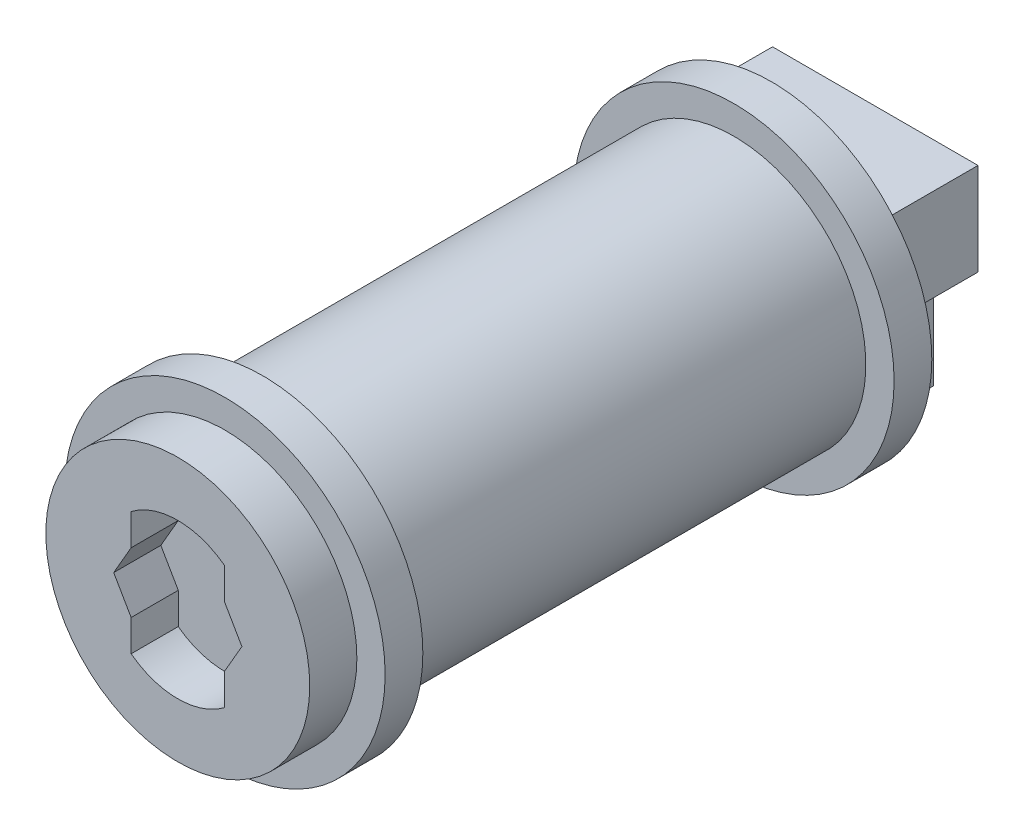
ISO-10303-21;
HEADER;
FILE_DESCRIPTION(('STEP AP214'),'2;1');
FILE_NAME('part.step','',(''),(''),'','','');
FILE_SCHEMA(('AUTOMOTIVE_DESIGN { 1 0 10303 214 1 1 1 1 }'));
ENDSEC;
DATA;
#1=APPLICATION_CONTEXT('core data for automotive mechanical design processes');
#2=APPLICATION_PROTOCOL_DEFINITION('international standard','automotive_design',2000,#1);
#3=PRODUCT_CONTEXT('',#1,'mechanical');
#4=PRODUCT('Part','Part','',(#3));
#5=PRODUCT_RELATED_PRODUCT_CATEGORY('part','',(#4));
#6=PRODUCT_DEFINITION_FORMATION('','',#4);
#7=PRODUCT_DEFINITION_CONTEXT('part definition',#1,'design');
#8=PRODUCT_DEFINITION('design','',#6,#7);
#9=PRODUCT_DEFINITION_SHAPE('','',#8);
#10=(LENGTH_UNIT() NAMED_UNIT(*) SI_UNIT(.MILLI.,.METRE.));
#11=(NAMED_UNIT(*) PLANE_ANGLE_UNIT() SI_UNIT($,.RADIAN.));
#12=(NAMED_UNIT(*) SI_UNIT($,.STERADIAN.) SOLID_ANGLE_UNIT());
#13=UNCERTAINTY_MEASURE_WITH_UNIT(LENGTH_MEASURE(1.E-05),#10,'distance_accuracy_value','');
#14=(GEOMETRIC_REPRESENTATION_CONTEXT(3) GLOBAL_UNCERTAINTY_ASSIGNED_CONTEXT((#13)) GLOBAL_UNIT_ASSIGNED_CONTEXT((#10,
#11,#12)) REPRESENTATION_CONTEXT('',''));
#15=CARTESIAN_POINT('',(0.,0.,0.));
#16=DIRECTION('',(0.,0.,1.));
#17=DIRECTION('',(1.,0.,0.));
#18=AXIS2_PLACEMENT_3D('',#15,#16,#17);
#19=CARTESIAN_POINT('',(-17.9999999993386,-1.27777996516976E-10,29.5));
#20=DIRECTION('',(0.,0.,-1.));
#21=DIRECTION('',(-1.,0.,0.));
#22=AXIS2_PLACEMENT_3D('',#19,#20,#21);
#23=CYLINDRICAL_SURFACE('',#22,7.00000000066145);
#24=CARTESIAN_POINT('',(-17.9999999993386,-1.27777996516976E-10,0.));
#25=DIRECTION('',(0.,0.,-1.));
#26=DIRECTION('',(-1.,0.,0.));
#27=AXIS2_PLACEMENT_3D('',#24,#25,#26);
#28=CIRCLE('',#27,7.00000000066145);
#29=CARTESIAN_POINT('',(-25.,-1.27777996516976E-10,0.));
#30=VERTEX_POINT('',#29);
#31=EDGE_CURVE('E249',#30,#30,#28,.F.);
#32=ORIENTED_EDGE('',*,*,#31,.T.);
#33=EDGE_LOOP('',(#32));
#34=FACE_BOUND('',#33,.T.);
#35=CARTESIAN_POINT('',(-17.9999999993386,-1.27777996516976E-10,25.));
#36=DIRECTION('',(0.,0.,1.));
#37=DIRECTION('',(1.,0.,0.));
#38=AXIS2_PLACEMENT_3D('',#35,#36,#37);
#39=CIRCLE('',#38,7.00000000066145);
#40=CARTESIAN_POINT('',(-10.9999999986771,-1.27777996516976E-10,25.));
#41=VERTEX_POINT('',#40);
#42=EDGE_CURVE('E11',#41,#41,#39,.T.);
#43=ORIENTED_EDGE('',*,*,#42,.F.);
#44=EDGE_LOOP('',(#43));
#45=FACE_BOUND('',#44,.T.);
#46=ADVANCED_FACE('F37',(#34,#45),#23,.T.);
#47=CARTESIAN_POINT('',(-17.9999999993386,-1.27777996516976E-10,29.5));
#48=DIRECTION('',(0.,0.,-1.));
#49=DIRECTION('',(-1.,0.,0.));
#50=AXIS2_PLACEMENT_3D('',#47,#48,#49);
#51=CYLINDRICAL_SURFACE('',#50,4.1);
#52=DIRECTION('',(0.,0.,-1.));
#53=VECTOR('',#52,1.);
#54=CARTESIAN_POINT('',(-20.475,-3.26869622289395,29.5));
#55=LINE('',#54,#53);
#56=CARTESIAN_POINT('',(-20.475,-3.26869622289395,25.));
#57=VERTEX_POINT('',#56);
#58=CARTESIAN_POINT('',(-20.475,-3.26869622289395,0.));
#59=VERTEX_POINT('',#58);
#60=EDGE_CURVE('E236',#57,#59,#55,.T.);
#61=ORIENTED_EDGE('',*,*,#60,.F.);
#62=CARTESIAN_POINT('',(-17.9999999993386,-1.27777996516976E-10,25.));
#63=DIRECTION('',(0.,0.,1.));
#64=DIRECTION('',(1.,0.,0.));
#65=AXIS2_PLACEMENT_3D('',#62,#63,#64);
#66=CIRCLE('',#65,4.1);
#67=CARTESIAN_POINT('',(-15.5249999991788,-3.2686962232738,25.));
#68=VERTEX_POINT('',#67);
#69=EDGE_CURVE('E389',#57,#68,#66,.T.);
#70=ORIENTED_EDGE('',*,*,#69,.T.);
#71=DIRECTION('',(0.,0.,-1.));
#72=VECTOR('',#71,1.);
#73=CARTESIAN_POINT('',(-15.5249999991788,-3.2686962232738,29.5));
#74=LINE('',#73,#72);
#75=CARTESIAN_POINT('',(-15.5249999991788,-3.2686962232738,0.));
#76=VERTEX_POINT('',#75);
#77=EDGE_CURVE('E329',#68,#76,#74,.T.);
#78=ORIENTED_EDGE('',*,*,#77,.T.);
#79=CARTESIAN_POINT('',(-17.9999999993386,-1.27777996516976E-10,0.));
#80=DIRECTION('',(0.,0.,1.));
#81=DIRECTION('',(1.,0.,0.));
#82=AXIS2_PLACEMENT_3D('',#79,#80,#81);
#83=CIRCLE('',#82,4.1);
#84=EDGE_CURVE('E386',#59,#76,#83,.T.);
#85=ORIENTED_EDGE('',*,*,#84,.F.);
#86=EDGE_LOOP('',(#61,#70,#78,#85));
#87=FACE_BOUND('',#86,.T.);
#88=ADVANCED_FACE('F473',(#87),#51,.F.);
#89=CARTESIAN_POINT('',(-15.5249999991788,-3.2686962232738,29.5));
#90=DIRECTION('',(-1.,0.,0.));
#91=DIRECTION('',(0.,0.,1.));
#92=AXIS2_PLACEMENT_3D('',#89,#90,#91);
#93=PLANE('',#92);
#94=ORIENTED_EDGE('',*,*,#77,.F.);
#95=DIRECTION('',(0.,1.,0.));
#96=VECTOR('',#95,1.);
#97=CARTESIAN_POINT('',(-15.5249999991788,-3.2686962232738,25.));
#98=LINE('',#97,#96);
#99=CARTESIAN_POINT('',(-15.5249999991788,-1.60214699517567,25.));
#100=VERTEX_POINT('',#99);
#101=EDGE_CURVE('E411',#68,#100,#98,.T.);
#102=ORIENTED_EDGE('',*,*,#101,.T.);
#103=DIRECTION('',(0.,0.,-1.));
#104=VECTOR('',#103,1.);
#105=CARTESIAN_POINT('',(-15.5249999991788,-1.60214699517567,29.5));
#106=LINE('',#105,#104);
#107=CARTESIAN_POINT('',(-15.5249999991788,-1.60214699517567,0.));
#108=VERTEX_POINT('',#107);
#109=EDGE_CURVE('E332',#100,#108,#106,.T.);
#110=ORIENTED_EDGE('',*,*,#109,.T.);
#111=DIRECTION('',(0.,1.,0.));
#112=VECTOR('',#111,1.);
#113=CARTESIAN_POINT('',(-15.5249999991788,-3.2686962232738,0.));
#114=LINE('',#113,#112);
#115=EDGE_CURVE('E383',#76,#108,#114,.T.);
#116=ORIENTED_EDGE('',*,*,#115,.F.);
#117=EDGE_LOOP('',(#94,#102,#110,#116));
#118=FACE_BOUND('',#117,.T.);
#119=ADVANCED_FACE('F481',(#118),#93,.T.);
#120=CARTESIAN_POINT('',(-15.5249999991788,-1.60214699517567,29.5));
#121=DIRECTION('',(-0.866025403784438,0.5,0.));
#122=DIRECTION('',(-0.5,-0.866025403784439,0.));
#123=AXIS2_PLACEMENT_3D('',#120,#121,#122);
#124=PLANE('',#123);
#125=ORIENTED_EDGE('',*,*,#109,.F.);
#126=DIRECTION('',(0.5,0.866025403784439,0.));
#127=VECTOR('',#126,1.);
#128=CARTESIAN_POINT('',(-15.5249999991788,-1.60214699517567,25.));
#129=LINE('',#128,#127);
#130=CARTESIAN_POINT('',(-14.5999999984554,3.07850450836688E-09,25.));
#131=VERTEX_POINT('',#130);
#132=EDGE_CURVE('E414',#100,#131,#129,.T.);
#133=ORIENTED_EDGE('',*,*,#132,.T.);
#134=DIRECTION('',(0.,0.,-1.));
#135=VECTOR('',#134,1.);
#136=CARTESIAN_POINT('',(-14.5999999984554,3.07850450836688E-09,29.5));
#137=LINE('',#136,#135);
#138=CARTESIAN_POINT('',(-14.5999999984554,3.07850450836688E-09,0.));
#139=VERTEX_POINT('',#138);
#140=EDGE_CURVE('E335',#131,#139,#137,.T.);
#141=ORIENTED_EDGE('',*,*,#140,.T.);
#142=DIRECTION('',(0.5,0.866025403784439,0.));
#143=VECTOR('',#142,1.);
#144=CARTESIAN_POINT('',(-15.5249999991788,-1.60214699517567,0.));
#145=LINE('',#144,#143);
#146=EDGE_CURVE('E380',#108,#139,#145,.T.);
#147=ORIENTED_EDGE('',*,*,#146,.F.);
#148=EDGE_LOOP('',(#125,#133,#141,#147));
#149=FACE_BOUND('',#148,.T.);
#150=ADVANCED_FACE('F572',(#149),#124,.T.);
#151=CARTESIAN_POINT('',(-14.5999999984554,3.07850450836688E-09,29.5));
#152=DIRECTION('',(-0.866025402836809,-0.500000001641344,0.));
#153=DIRECTION('',(0.500000001641344,-0.866025402836809,0.));
#154=AXIS2_PLACEMENT_3D('',#151,#152,#153);
#155=PLANE('',#154);
#156=ORIENTED_EDGE('',*,*,#140,.F.);
#157=DIRECTION('',(-0.500000001641344,0.866025402836809,0.));
#158=VECTOR('',#157,1.);
#159=CARTESIAN_POINT('',(-14.5999999984554,3.07850450836688E-09,25.));
#160=LINE('',#159,#158);
#161=CARTESIAN_POINT('',(-15.5249999991788,1.60214699432022,25.));
#162=VERTEX_POINT('',#161);
#163=EDGE_CURVE('E417',#131,#162,#160,.T.);
#164=ORIENTED_EDGE('',*,*,#163,.T.);
#165=DIRECTION('',(0.,0.,-1.));
#166=VECTOR('',#165,1.);
#167=CARTESIAN_POINT('',(-15.5249999991788,1.60214699432022,29.5));
#168=LINE('',#167,#166);
#169=CARTESIAN_POINT('',(-15.5249999991788,1.60214699432022,0.));
#170=VERTEX_POINT('',#169);
#171=EDGE_CURVE('E339',#162,#170,#168,.T.);
#172=ORIENTED_EDGE('',*,*,#171,.T.);
#173=DIRECTION('',(-0.500000001641344,0.866025402836808,0.));
#174=VECTOR('',#173,1.);
#175=CARTESIAN_POINT('',(-14.5999999984554,3.07850450836688E-09,0.));
#176=LINE('',#175,#174);
#177=EDGE_CURVE('E377',#139,#170,#176,.T.);
#178=ORIENTED_EDGE('',*,*,#177,.F.);
#179=EDGE_LOOP('',(#156,#164,#172,#178));
#180=FACE_BOUND('',#179,.T.);
#181=ADVANCED_FACE('F569',(#180),#155,.T.);
#182=CARTESIAN_POINT('',(-15.5249999991788,1.60214699432022,29.5));
#183=DIRECTION('',(-1.,0.,0.));
#184=DIRECTION('',(0.,0.,1.));
#185=AXIS2_PLACEMENT_3D('',#182,#183,#184);
#186=PLANE('',#185);
#187=ORIENTED_EDGE('',*,*,#171,.F.);
#188=DIRECTION('',(0.,1.,0.));
#189=VECTOR('',#188,1.);
#190=CARTESIAN_POINT('',(-15.5249999991788,1.60214699432022,25.));
#191=LINE('',#190,#189);
#192=CARTESIAN_POINT('',(-15.5249999991788,3.26869622301824,25.));
#193=VERTEX_POINT('',#192);
#194=EDGE_CURVE('E420',#162,#193,#191,.T.);
#195=ORIENTED_EDGE('',*,*,#194,.T.);
#196=DIRECTION('',(0.,0.,-1.));
#197=VECTOR('',#196,1.);
#198=CARTESIAN_POINT('',(-15.5249999991788,3.26869622301824,29.5));
#199=LINE('',#198,#197);
#200=CARTESIAN_POINT('',(-15.5249999991788,3.26869622301824,0.));
#201=VERTEX_POINT('',#200);
#202=EDGE_CURVE('E343',#193,#201,#199,.T.);
#203=ORIENTED_EDGE('',*,*,#202,.T.);
#204=DIRECTION('',(0.,1.,0.));
#205=VECTOR('',#204,1.);
#206=CARTESIAN_POINT('',(-15.5249999991788,1.60214699432022,0.));
#207=LINE('',#206,#205);
#208=EDGE_CURVE('E374',#170,#201,#207,.T.);
#209=ORIENTED_EDGE('',*,*,#208,.F.);
#210=EDGE_LOOP('',(#187,#195,#203,#209));
#211=FACE_BOUND('',#210,.T.);
#212=ADVANCED_FACE('F564',(#211),#186,.T.);
#213=CARTESIAN_POINT('',(-17.9999999993386,-1.27777996516976E-10,29.5));
#214=DIRECTION('',(0.,0.,-1.));
#215=DIRECTION('',(-1.,0.,0.));
#216=AXIS2_PLACEMENT_3D('',#213,#214,#215);
#217=CYLINDRICAL_SURFACE('',#216,4.1);
#218=ORIENTED_EDGE('',*,*,#202,.F.);
#219=CARTESIAN_POINT('',(-17.9999999993386,-1.27777996516976E-10,25.));
#220=DIRECTION('',(0.,0.,1.));
#221=DIRECTION('',(1.,0.,0.));
#222=AXIS2_PLACEMENT_3D('',#219,#220,#221);
#223=CIRCLE('',#222,4.1);
#224=CARTESIAN_POINT('',(-20.475,3.2686962226384,25.));
#225=VERTEX_POINT('',#224);
#226=EDGE_CURVE('E423',#193,#225,#223,.T.);
#227=ORIENTED_EDGE('',*,*,#226,.T.);
#228=DIRECTION('',(0.,0.,-1.));
#229=VECTOR('',#228,1.);
#230=CARTESIAN_POINT('',(-20.475,3.2686962226384,29.5));
#231=LINE('',#230,#229);
#232=CARTESIAN_POINT('',(-20.475,3.2686962226384,0.));
#233=VERTEX_POINT('',#232);
#234=EDGE_CURVE('E347',#225,#233,#231,.T.);
#235=ORIENTED_EDGE('',*,*,#234,.T.);
#236=CARTESIAN_POINT('',(-17.9999999993386,-1.27777996516976E-10,0.));
#237=DIRECTION('',(0.,0.,1.));
#238=DIRECTION('',(1.,0.,0.));
#239=AXIS2_PLACEMENT_3D('',#236,#237,#238);
#240=CIRCLE('',#239,4.1);
#241=EDGE_CURVE('E371',#201,#233,#240,.T.);
#242=ORIENTED_EDGE('',*,*,#241,.F.);
#243=EDGE_LOOP('',(#218,#227,#235,#242));
#244=FACE_BOUND('',#243,.T.);
#245=ADVANCED_FACE('F561',(#244),#217,.F.);
#246=CARTESIAN_POINT('',(-20.475,3.2686962226384,29.5));
#247=DIRECTION('',(1.,0.,0.));
#248=DIRECTION('',(0.,0.,-1.));
#249=AXIS2_PLACEMENT_3D('',#246,#247,#248);
#250=PLANE('',#249);
#251=ORIENTED_EDGE('',*,*,#234,.F.);
#252=DIRECTION('',(0.,-1.,0.));
#253=VECTOR('',#252,1.);
#254=CARTESIAN_POINT('',(-20.475,3.2686962226384,25.));
#255=LINE('',#254,#253);
#256=CARTESIAN_POINT('',(-20.475,1.60214699504789,25.));
#257=VERTEX_POINT('',#256);
#258=EDGE_CURVE('E426',#225,#257,#255,.T.);
#259=ORIENTED_EDGE('',*,*,#258,.T.);
#260=DIRECTION('',(0.,0.,-1.));
#261=VECTOR('',#260,1.);
#262=CARTESIAN_POINT('',(-20.475,1.60214699504789,29.5));
#263=LINE('',#262,#261);
#264=CARTESIAN_POINT('',(-20.475,1.60214699504789,0.));
#265=VERTEX_POINT('',#264);
#266=EDGE_CURVE('E351',#257,#265,#263,.T.);
#267=ORIENTED_EDGE('',*,*,#266,.T.);
#268=DIRECTION('',(0.,-1.,0.));
#269=VECTOR('',#268,1.);
#270=CARTESIAN_POINT('',(-20.475,3.2686962226384,0.));
#271=LINE('',#270,#269);
#272=EDGE_CURVE('E368',#233,#265,#271,.T.);
#273=ORIENTED_EDGE('',*,*,#272,.F.);
#274=EDGE_LOOP('',(#251,#259,#267,#273));
#275=FACE_BOUND('',#274,.T.);
#276=ADVANCED_FACE('F547',(#275),#250,.T.);
#277=CARTESIAN_POINT('',(-20.475,1.60214699504789,29.5));
#278=DIRECTION('',(0.866025404040016,-0.499999999557327,0.));
#279=DIRECTION('',(0.499999999557327,0.866025404040016,0.));
#280=AXIS2_PLACEMENT_3D('',#277,#278,#279);
#281=PLANE('',#280);
#282=ORIENTED_EDGE('',*,*,#266,.F.);
#283=DIRECTION('',(-0.499999999557327,-0.866025404040016,0.));
#284=VECTOR('',#283,1.);
#285=CARTESIAN_POINT('',(-20.475,1.60214699504789,25.));
#286=LINE('',#285,#284);
#287=CARTESIAN_POINT('',(-21.3999999985215,-1.28368837911882E-09,25.));
#288=VERTEX_POINT('',#287);
#289=EDGE_CURVE('E429',#257,#288,#286,.T.);
#290=ORIENTED_EDGE('',*,*,#289,.T.);
#291=DIRECTION('',(0.,0.,-1.));
#292=VECTOR('',#291,1.);
#293=CARTESIAN_POINT('',(-21.3999999985215,-1.28368837911882E-09,29.5));
#294=LINE('',#293,#292);
#295=CARTESIAN_POINT('',(-21.3999999985215,-1.28368837911882E-09,0.));
#296=VERTEX_POINT('',#295);
#297=EDGE_CURVE('E355',#288,#296,#294,.T.);
#298=ORIENTED_EDGE('',*,*,#297,.T.);
#299=DIRECTION('',(-0.499999999557327,-0.866025404040016,0.));
#300=VECTOR('',#299,1.);
#301=CARTESIAN_POINT('',(-20.475,1.60214699504789,0.));
#302=LINE('',#301,#300);
#303=EDGE_CURVE('E365',#265,#296,#302,.T.);
#304=ORIENTED_EDGE('',*,*,#303,.F.);
#305=EDGE_LOOP('',(#282,#290,#298,#304));
#306=FACE_BOUND('',#305,.T.);
#307=ADVANCED_FACE('F536',(#306),#281,.T.);
#308=CARTESIAN_POINT('',(-21.3999999985215,-1.28368837911882E-09,29.5));
#309=DIRECTION('',(0.866025403784439,0.5,0.));
#310=DIRECTION('',(-0.5,0.866025403784439,0.));
#311=AXIS2_PLACEMENT_3D('',#308,#309,#310);
#312=PLANE('',#311);
#313=ORIENTED_EDGE('',*,*,#297,.F.);
#314=DIRECTION('',(0.5,-0.866025403784439,0.));
#315=VECTOR('',#314,1.);
#316=CARTESIAN_POINT('',(-21.3999999985215,-1.28368837911882E-09,25.));
#317=LINE('',#316,#315);
#318=CARTESIAN_POINT('',(-20.475,-1.602146995724,25.));
#319=VERTEX_POINT('',#318);
#320=EDGE_CURVE('E432',#288,#319,#317,.T.);
#321=ORIENTED_EDGE('',*,*,#320,.T.);
#322=DIRECTION('',(0.,0.,-1.));
#323=VECTOR('',#322,1.);
#324=CARTESIAN_POINT('',(-20.475,-1.602146995724,29.5));
#325=LINE('',#324,#323);
#326=CARTESIAN_POINT('',(-20.475,-1.602146995724,0.));
#327=VERTEX_POINT('',#326);
#328=EDGE_CURVE('E235',#319,#327,#325,.T.);
#329=ORIENTED_EDGE('',*,*,#328,.T.);
#330=DIRECTION('',(0.5,-0.866025403784439,0.));
#331=VECTOR('',#330,1.);
#332=CARTESIAN_POINT('',(-21.3999999985215,-1.28368837911882E-09,0.));
#333=LINE('',#332,#331);
#334=EDGE_CURVE('E362',#296,#327,#333,.T.);
#335=ORIENTED_EDGE('',*,*,#334,.F.);
#336=EDGE_LOOP('',(#313,#321,#329,#335));
#337=FACE_BOUND('',#336,.T.);
#338=ADVANCED_FACE('F531',(#337),#312,.T.);
#339=CARTESIAN_POINT('',(-20.475,-1.602146995724,29.5));
#340=DIRECTION('',(1.,0.,0.));
#341=DIRECTION('',(0.,0.,-1.));
#342=AXIS2_PLACEMENT_3D('',#339,#340,#341);
#343=PLANE('',#342);
#344=ORIENTED_EDGE('',*,*,#328,.F.);
#345=DIRECTION('',(0.,-1.,0.));
#346=VECTOR('',#345,1.);
#347=CARTESIAN_POINT('',(-20.475,-1.602146995724,25.));
#348=LINE('',#347,#346);
#349=EDGE_CURVE('E41',#319,#57,#348,.T.);
#350=ORIENTED_EDGE('',*,*,#349,.T.);
#351=ORIENTED_EDGE('',*,*,#60,.T.);
#352=DIRECTION('',(0.,-1.,0.));
#353=VECTOR('',#352,1.);
#354=CARTESIAN_POINT('',(-20.475,-1.602146995724,0.));
#355=LINE('',#354,#353);
#356=EDGE_CURVE('E358',#327,#59,#355,.T.);
#357=ORIENTED_EDGE('',*,*,#356,.F.);
#358=EDGE_LOOP('',(#344,#350,#351,#357));
#359=FACE_BOUND('',#358,.T.);
#360=ADVANCED_FACE('F538',(#359),#343,.T.);
#361=CARTESIAN_POINT('',(-14.5592,-4.1492,0.));
#362=DIRECTION('',(0.,0.,-1.));
#363=DIRECTION('',(-1.,0.,0.));
#364=AXIS2_PLACEMENT_3D('',#361,#362,#363);
#365=PLANE('',#364);
#366=CARTESIAN_POINT('',(-18.,0.,0.));
#367=DIRECTION('',(0.,0.,1.));
#368=DIRECTION('',(1.,0.,0.));
#369=AXIS2_PLACEMENT_3D('',#366,#367,#368);
#370=CIRCLE('',#369,8.5);
#371=CARTESIAN_POINT('',(-9.5,0.,0.));
#372=VERTEX_POINT('',#371);
#373=EDGE_CURVE('E255',#372,#372,#370,.T.);
#374=ORIENTED_EDGE('',*,*,#373,.T.);
#375=EDGE_LOOP('',(#374));
#376=FACE_BOUND('',#375,.T.);
#377=ORIENTED_EDGE('',*,*,#31,.F.);
#378=EDGE_LOOP('',(#377));
#379=FACE_BOUND('',#378,.T.);
#380=ADVANCED_FACE('F545',(#376,#379),#365,.F.);
#381=CARTESIAN_POINT('',(-9.398,-8.602,-2.));
#382=DIRECTION('',(0.,0.,-1.));
#383=DIRECTION('',(-1.,0.,0.));
#384=AXIS2_PLACEMENT_3D('',#381,#382,#383);
#385=PLANE('',#384);
#386=CARTESIAN_POINT('',(-18.,0.,-2.));
#387=DIRECTION('',(0.,0.,1.));
#388=DIRECTION('',(1.,0.,0.));
#389=AXIS2_PLACEMENT_3D('',#386,#387,#388);
#390=CIRCLE('',#389,8.5);
#391=CARTESIAN_POINT('',(-9.5,0.,-2.));
#392=VERTEX_POINT('',#391);
#393=EDGE_CURVE('E252',#392,#392,#390,.F.);
#394=ORIENTED_EDGE('',*,*,#393,.T.);
#395=EDGE_LOOP('',(#394));
#396=FACE_BOUND('',#395,.T.);
#397=DIRECTION('',(1.,0.,0.));
#398=VECTOR('',#397,1.);
#399=CARTESIAN_POINT('',(-12.549999998012,4.629434044448,-2.));
#400=LINE('',#399,#398);
#401=CARTESIAN_POINT('',(-23.450000000994,4.629434044448,-2.));
#402=VERTEX_POINT('',#401);
#403=CARTESIAN_POINT('',(-12.549999998012,4.629434044448,-2.));
#404=VERTEX_POINT('',#403);
#405=EDGE_CURVE('E299',#402,#404,#400,.T.);
#406=ORIENTED_EDGE('',*,*,#405,.F.);
#407=DIRECTION('',(0.,1.,0.));
#408=VECTOR('',#407,1.);
#409=CARTESIAN_POINT('',(-23.450000000994,4.629434044448,-2.));
#410=LINE('',#409,#408);
#411=CARTESIAN_POINT('',(-23.450000000994,-0.270565961522,-2.));
#412=VERTEX_POINT('',#411);
#413=EDGE_CURVE('E301',#412,#402,#410,.T.);
#414=ORIENTED_EDGE('',*,*,#413,.F.);
#415=DIRECTION('',(-1.,0.,0.));
#416=VECTOR('',#415,1.);
#417=CARTESIAN_POINT('',(-23.450000000994,-0.270565961522,-2.));
#418=LINE('',#417,#416);
#419=CARTESIAN_POINT('',(-21.099999998553,-0.270565961521999,-2.));
#420=VERTEX_POINT('',#419);
#421=EDGE_CURVE('E285',#420,#412,#418,.T.);
#422=ORIENTED_EDGE('',*,*,#421,.F.);
#423=DIRECTION('',(0.,1.,0.));
#424=VECTOR('',#423,1.);
#425=CARTESIAN_POINT('',(-21.099999998553,-0.270565961521999,-2.));
#426=LINE('',#425,#424);
#427=CARTESIAN_POINT('',(-21.099999998553,-6.670565961032,-2.));
#428=VERTEX_POINT('',#427);
#429=EDGE_CURVE('E288',#428,#420,#426,.T.);
#430=ORIENTED_EDGE('',*,*,#429,.F.);
#431=DIRECTION('',(-1.,0.,0.));
#432=VECTOR('',#431,1.);
#433=CARTESIAN_POINT('',(-21.099999998553,-6.670565961032,-2.));
#434=LINE('',#433,#432);
#435=CARTESIAN_POINT('',(-14.900000001447,-6.670565961032,-2.));
#436=VERTEX_POINT('',#435);
#437=EDGE_CURVE('E291',#436,#428,#434,.T.);
#438=ORIENTED_EDGE('',*,*,#437,.F.);
#439=DIRECTION('',(0.,-1.,0.));
#440=VECTOR('',#439,1.);
#441=CARTESIAN_POINT('',(-14.900000001447,-6.670565961032,-2.));
#442=LINE('',#441,#440);
#443=CARTESIAN_POINT('',(-14.900000001447,-0.270565961522,-2.));
#444=VERTEX_POINT('',#443);
#445=EDGE_CURVE('E293',#444,#436,#442,.T.);
#446=ORIENTED_EDGE('',*,*,#445,.F.);
#447=DIRECTION('',(-1.,0.,0.));
#448=VECTOR('',#447,1.);
#449=CARTESIAN_POINT('',(-14.900000001447,-0.270565961522,-2.));
#450=LINE('',#449,#448);
#451=CARTESIAN_POINT('',(-12.549999998012,-0.270565961522,-2.));
#452=VERTEX_POINT('',#451);
#453=EDGE_CURVE('E295',#452,#444,#450,.T.);
#454=ORIENTED_EDGE('',*,*,#453,.F.);
#455=DIRECTION('',(0.,-1.,0.));
#456=VECTOR('',#455,1.);
#457=CARTESIAN_POINT('',(-12.549999998012,-0.270565961522,-2.));
#458=LINE('',#457,#456);
#459=EDGE_CURVE('E297',#404,#452,#458,.T.);
#460=ORIENTED_EDGE('',*,*,#459,.F.);
#461=EDGE_LOOP('',(#406,#414,#422,#430,#438,#446,#454,#460));
#462=FACE_BOUND('',#461,.T.);
#463=ADVANCED_FACE('F585',(#396,#462),#385,.T.);
#464=CARTESIAN_POINT('',(-18.,0.,-2.));
#465=DIRECTION('',(0.,0.,1.));
#466=DIRECTION('',(1.,0.,0.));
#467=AXIS2_PLACEMENT_3D('',#464,#465,#466);
#468=CYLINDRICAL_SURFACE('',#467,8.5);
#469=ORIENTED_EDGE('',*,*,#373,.F.);
#470=EDGE_LOOP('',(#469));
#471=FACE_BOUND('',#470,.T.);
#472=ORIENTED_EDGE('',*,*,#393,.F.);
#473=EDGE_LOOP('',(#472));
#474=FACE_BOUND('',#473,.T.);
#475=ADVANCED_FACE('F584',(#471,#474),#468,.T.);
#476=ORIENTED_EDGE('',*,*,#356,.T.);
#477=ORIENTED_EDGE('',*,*,#84,.T.);
#478=ORIENTED_EDGE('',*,*,#115,.T.);
#479=ORIENTED_EDGE('',*,*,#146,.T.);
#480=ORIENTED_EDGE('',*,*,#177,.T.);
#481=ORIENTED_EDGE('',*,*,#208,.T.);
#482=ORIENTED_EDGE('',*,*,#241,.T.);
#483=ORIENTED_EDGE('',*,*,#272,.T.);
#484=ORIENTED_EDGE('',*,*,#303,.T.);
#485=ORIENTED_EDGE('',*,*,#334,.T.);
#486=EDGE_LOOP('',(#476,#477,#478,#479,#480,#481,#482,#483,#484,#485));
#487=FACE_BOUND('',#486,.T.);
#488=CARTESIAN_POINT('',(-18.,0.,0.));
#489=DIRECTION('',(0.,0.,1.));
#490=DIRECTION('',(1.,0.,0.));
#491=AXIS2_PLACEMENT_3D('',#488,#489,#490);
#492=CIRCLE('',#491,1.89999999999999);
#493=CARTESIAN_POINT('',(-16.1,0.,0.));
#494=VERTEX_POINT('',#493);
#495=EDGE_CURVE('E322',#494,#494,#492,.T.);
#496=ORIENTED_EDGE('',*,*,#495,.F.);
#497=EDGE_LOOP('',(#496));
#498=FACE_BOUND('',#497,.T.);
#499=ADVANCED_FACE('F39',(#487,#498),#365,.F.);
#500=CARTESIAN_POINT('',(-23.450000000994,4.629434044448,-7.5));
#501=DIRECTION('',(1.,0.,0.));
#502=DIRECTION('',(0.,0.,-1.));
#503=AXIS2_PLACEMENT_3D('',#500,#501,#502);
#504=PLANE('',#503);
#505=ORIENTED_EDGE('',*,*,#413,.T.);
#506=DIRECTION('',(0.,0.,1.));
#507=VECTOR('',#506,1.);
#508=CARTESIAN_POINT('',(-23.450000000994,4.629434044448,-7.5));
#509=LINE('',#508,#507);
#510=CARTESIAN_POINT('',(-23.450000000994,4.629434044448,-7.5));
#511=VERTEX_POINT('',#510);
#512=EDGE_CURVE('E259',#511,#402,#509,.T.);
#513=ORIENTED_EDGE('',*,*,#512,.F.);
#514=DIRECTION('',(0.,1.,0.));
#515=VECTOR('',#514,1.);
#516=CARTESIAN_POINT('',(-23.450000000994,4.629434044448,-7.5));
#517=LINE('',#516,#515);
#518=CARTESIAN_POINT('',(-23.450000000994,-0.270565961522,-7.5));
#519=VERTEX_POINT('',#518);
#520=EDGE_CURVE('E287',#519,#511,#517,.T.);
#521=ORIENTED_EDGE('',*,*,#520,.F.);
#522=DIRECTION('',(0.,0.,1.));
#523=VECTOR('',#522,1.);
#524=CARTESIAN_POINT('',(-23.450000000994,-0.270565961522,-7.5));
#525=LINE('',#524,#523);
#526=EDGE_CURVE('E281',#519,#412,#525,.T.);
#527=ORIENTED_EDGE('',*,*,#526,.T.);
#528=EDGE_LOOP('',(#505,#513,#521,#527));
#529=FACE_BOUND('',#528,.T.);
#530=ADVANCED_FACE('F583',(#529),#504,.F.);
#531=CARTESIAN_POINT('',(-12.549999998012,4.629434044448,-7.5));
#532=DIRECTION('',(0.,-1.,0.));
#533=DIRECTION('',(0.,0.,-1.));
#534=AXIS2_PLACEMENT_3D('',#531,#532,#533);
#535=PLANE('',#534);
#536=ORIENTED_EDGE('',*,*,#405,.T.);
#537=DIRECTION('',(0.,0.,1.));
#538=VECTOR('',#537,1.);
#539=CARTESIAN_POINT('',(-12.549999998012,4.629434044448,-7.5));
#540=LINE('',#539,#538);
#541=CARTESIAN_POINT('',(-12.549999998012,4.629434044448,-7.5));
#542=VERTEX_POINT('',#541);
#543=EDGE_CURVE('E264',#542,#404,#540,.T.);
#544=ORIENTED_EDGE('',*,*,#543,.F.);
#545=DIRECTION('',(1.,0.,0.));
#546=VECTOR('',#545,1.);
#547=CARTESIAN_POINT('',(-12.549999998012,4.629434044448,-7.5));
#548=LINE('',#547,#546);
#549=EDGE_CURVE('E316',#511,#542,#548,.T.);
#550=ORIENTED_EDGE('',*,*,#549,.F.);
#551=ORIENTED_EDGE('',*,*,#512,.T.);
#552=EDGE_LOOP('',(#536,#544,#550,#551));
#553=FACE_BOUND('',#552,.T.);
#554=ADVANCED_FACE('F623',(#553),#535,.F.);
#555=CARTESIAN_POINT('',(-12.549999998012,-0.270565961522,-7.5));
#556=DIRECTION('',(-1.,0.,0.));
#557=DIRECTION('',(0.,0.,1.));
#558=AXIS2_PLACEMENT_3D('',#555,#556,#557);
#559=PLANE('',#558);
#560=ORIENTED_EDGE('',*,*,#459,.T.);
#561=DIRECTION('',(0.,0.,1.));
#562=VECTOR('',#561,1.);
#563=CARTESIAN_POINT('',(-12.549999998012,-0.270565961522,-7.5));
#564=LINE('',#563,#562);
#565=CARTESIAN_POINT('',(-12.549999998012,-0.270565961522,-7.5));
#566=VERTEX_POINT('',#565);
#567=EDGE_CURVE('E267',#566,#452,#564,.T.);
#568=ORIENTED_EDGE('',*,*,#567,.F.);
#569=DIRECTION('',(0.,-1.,0.));
#570=VECTOR('',#569,1.);
#571=CARTESIAN_POINT('',(-12.549999998012,-0.270565961522,-7.5));
#572=LINE('',#571,#570);
#573=EDGE_CURVE('E314',#542,#566,#572,.T.);
#574=ORIENTED_EDGE('',*,*,#573,.F.);
#575=ORIENTED_EDGE('',*,*,#543,.T.);
#576=EDGE_LOOP('',(#560,#568,#574,#575));
#577=FACE_BOUND('',#576,.T.);
#578=ADVANCED_FACE('F619',(#577),#559,.F.);
#579=CARTESIAN_POINT('',(-14.900000001447,-0.270565961522,-7.5));
#580=DIRECTION('',(0.,1.,0.));
#581=DIRECTION('',(-1.,0.,0.));
#582=AXIS2_PLACEMENT_3D('',#579,#580,#581);
#583=PLANE('',#582);
#584=ORIENTED_EDGE('',*,*,#453,.T.);
#585=DIRECTION('',(0.,0.,1.));
#586=VECTOR('',#585,1.);
#587=CARTESIAN_POINT('',(-14.900000001447,-0.270565961522,-7.5));
#588=LINE('',#587,#586);
#589=CARTESIAN_POINT('',(-14.900000001447,-0.270565961522,-7.5));
#590=VERTEX_POINT('',#589);
#591=EDGE_CURVE('E270',#590,#444,#588,.T.);
#592=ORIENTED_EDGE('',*,*,#591,.F.);
#593=DIRECTION('',(-1.,0.,0.));
#594=VECTOR('',#593,1.);
#595=CARTESIAN_POINT('',(-14.900000001447,-0.270565961522,-7.5));
#596=LINE('',#595,#594);
#597=EDGE_CURVE('E312',#566,#590,#596,.T.);
#598=ORIENTED_EDGE('',*,*,#597,.F.);
#599=ORIENTED_EDGE('',*,*,#567,.T.);
#600=EDGE_LOOP('',(#584,#592,#598,#599));
#601=FACE_BOUND('',#600,.T.);
#602=ADVANCED_FACE('F615',(#601),#583,.F.);
#603=CARTESIAN_POINT('',(-14.900000001447,-6.670565961032,-7.5));
#604=DIRECTION('',(-1.,0.,0.));
#605=DIRECTION('',(0.,0.,1.));
#606=AXIS2_PLACEMENT_3D('',#603,#604,#605);
#607=PLANE('',#606);
#608=ORIENTED_EDGE('',*,*,#445,.T.);
#609=DIRECTION('',(0.,0.,1.));
#610=VECTOR('',#609,1.);
#611=CARTESIAN_POINT('',(-14.900000001447,-6.670565961032,-7.5));
#612=LINE('',#611,#610);
#613=CARTESIAN_POINT('',(-14.900000001447,-6.670565961032,-7.5));
#614=VERTEX_POINT('',#613);
#615=EDGE_CURVE('E273',#614,#436,#612,.T.);
#616=ORIENTED_EDGE('',*,*,#615,.F.);
#617=DIRECTION('',(0.,-1.,0.));
#618=VECTOR('',#617,1.);
#619=CARTESIAN_POINT('',(-14.900000001447,-6.670565961032,-7.5));
#620=LINE('',#619,#618);
#621=EDGE_CURVE('E310',#590,#614,#620,.T.);
#622=ORIENTED_EDGE('',*,*,#621,.F.);
#623=ORIENTED_EDGE('',*,*,#591,.T.);
#624=EDGE_LOOP('',(#608,#616,#622,#623));
#625=FACE_BOUND('',#624,.T.);
#626=ADVANCED_FACE('F611',(#625),#607,.F.);
#627=CARTESIAN_POINT('',(-21.099999998553,-6.670565961032,-7.5));
#628=DIRECTION('',(0.,1.,0.));
#629=DIRECTION('',(0.,0.,1.));
#630=AXIS2_PLACEMENT_3D('',#627,#628,#629);
#631=PLANE('',#630);
#632=ORIENTED_EDGE('',*,*,#437,.T.);
#633=DIRECTION('',(0.,0.,1.));
#634=VECTOR('',#633,1.);
#635=CARTESIAN_POINT('',(-21.099999998553,-6.670565961032,-7.5));
#636=LINE('',#635,#634);
#637=CARTESIAN_POINT('',(-21.099999998553,-6.670565961032,-7.5));
#638=VERTEX_POINT('',#637);
#639=EDGE_CURVE('E276',#638,#428,#636,.T.);
#640=ORIENTED_EDGE('',*,*,#639,.F.);
#641=DIRECTION('',(-1.,0.,0.));
#642=VECTOR('',#641,1.);
#643=CARTESIAN_POINT('',(-21.099999998553,-6.670565961032,-7.5));
#644=LINE('',#643,#642);
#645=EDGE_CURVE('E308',#614,#638,#644,.T.);
#646=ORIENTED_EDGE('',*,*,#645,.F.);
#647=ORIENTED_EDGE('',*,*,#615,.T.);
#648=EDGE_LOOP('',(#632,#640,#646,#647));
#649=FACE_BOUND('',#648,.T.);
#650=ADVANCED_FACE('F607',(#649),#631,.F.);
#651=CARTESIAN_POINT('',(-21.099999998553,-0.270565961521999,-7.5));
#652=DIRECTION('',(1.,0.,0.));
#653=DIRECTION('',(0.,0.,-1.));
#654=AXIS2_PLACEMENT_3D('',#651,#652,#653);
#655=PLANE('',#654);
#656=ORIENTED_EDGE('',*,*,#429,.T.);
#657=DIRECTION('',(0.,0.,1.));
#658=VECTOR('',#657,1.);
#659=CARTESIAN_POINT('',(-21.099999998553,-0.270565961521999,-7.5));
#660=LINE('',#659,#658);
#661=CARTESIAN_POINT('',(-21.099999998553,-0.270565961521999,-7.5));
#662=VERTEX_POINT('',#661);
#663=EDGE_CURVE('E279',#662,#420,#660,.T.);
#664=ORIENTED_EDGE('',*,*,#663,.F.);
#665=DIRECTION('',(0.,1.,0.));
#666=VECTOR('',#665,1.);
#667=CARTESIAN_POINT('',(-21.099999998553,-0.270565961521999,-7.5));
#668=LINE('',#667,#666);
#669=EDGE_CURVE('E306',#638,#662,#668,.T.);
#670=ORIENTED_EDGE('',*,*,#669,.F.);
#671=ORIENTED_EDGE('',*,*,#639,.T.);
#672=EDGE_LOOP('',(#656,#664,#670,#671));
#673=FACE_BOUND('',#672,.T.);
#674=ADVANCED_FACE('F603',(#673),#655,.F.);
#675=CARTESIAN_POINT('',(-23.450000000994,-0.270565961522,-7.5));
#676=DIRECTION('',(0.,1.,0.));
#677=DIRECTION('',(-1.,0.,0.));
#678=AXIS2_PLACEMENT_3D('',#675,#676,#677);
#679=PLANE('',#678);
#680=ORIENTED_EDGE('',*,*,#421,.T.);
#681=ORIENTED_EDGE('',*,*,#526,.F.);
#682=DIRECTION('',(-1.,0.,0.));
#683=VECTOR('',#682,1.);
#684=CARTESIAN_POINT('',(-23.450000000994,-0.270565961522,-7.5));
#685=LINE('',#684,#683);
#686=EDGE_CURVE('E284',#662,#519,#685,.T.);
#687=ORIENTED_EDGE('',*,*,#686,.F.);
#688=ORIENTED_EDGE('',*,*,#663,.T.);
#689=EDGE_LOOP('',(#680,#681,#687,#688));
#690=FACE_BOUND('',#689,.T.);
#691=ADVANCED_FACE('F596',(#690),#679,.F.);
#692=CARTESIAN_POINT('',(0.,0.,-7.5));
#693=DIRECTION('',(0.,0.,1.));
#694=DIRECTION('',(1.,0.,0.));
#695=AXIS2_PLACEMENT_3D('',#692,#693,#694);
#696=PLANE('',#695);
#697=CARTESIAN_POINT('',(-18.,0.,-7.50000000000001));
#698=DIRECTION('',(0.,0.,1.));
#699=DIRECTION('',(1.,0.,0.));
#700=AXIS2_PLACEMENT_3D('',#697,#698,#699);
#701=CIRCLE('',#700,1.89999999999998);
#702=CARTESIAN_POINT('',(-16.1,0.,-7.50000000000001));
#703=VERTEX_POINT('',#702);
#704=EDGE_CURVE('E304',#703,#703,#701,.T.);
#705=ORIENTED_EDGE('',*,*,#704,.T.);
#706=EDGE_LOOP('',(#705));
#707=FACE_BOUND('',#706,.T.);
#708=ORIENTED_EDGE('',*,*,#520,.T.);
#709=ORIENTED_EDGE('',*,*,#549,.T.);
#710=ORIENTED_EDGE('',*,*,#573,.T.);
#711=ORIENTED_EDGE('',*,*,#597,.T.);
#712=ORIENTED_EDGE('',*,*,#621,.T.);
#713=ORIENTED_EDGE('',*,*,#645,.T.);
#714=ORIENTED_EDGE('',*,*,#669,.T.);
#715=ORIENTED_EDGE('',*,*,#686,.T.);
#716=EDGE_LOOP('',(#708,#709,#710,#711,#712,#713,#714,#715));
#717=FACE_BOUND('',#716,.T.);
#718=ADVANCED_FACE('F590',(#707,#717),#696,.F.);
#719=CARTESIAN_POINT('',(-18.,0.,0.));
#720=DIRECTION('',(0.,0.,1.));
#721=DIRECTION('',(1.,0.,0.));
#722=AXIS2_PLACEMENT_3D('',#719,#720,#721);
#723=CYLINDRICAL_SURFACE('',#722,1.89999999999998);
#724=ORIENTED_EDGE('',*,*,#704,.F.);
#725=EDGE_LOOP('',(#724));
#726=FACE_BOUND('',#725,.T.);
#727=ORIENTED_EDGE('',*,*,#495,.T.);
#728=EDGE_LOOP('',(#727));
#729=FACE_BOUND('',#728,.T.);
#730=ADVANCED_FACE('F588',(#726,#729),#723,.F.);
#731=CARTESIAN_POINT('',(-17.9999999993386,-1.27777996516976E-10,25.));
#732=DIRECTION('',(0.,0.,1.));
#733=DIRECTION('',(1.,0.,0.));
#734=AXIS2_PLACEMENT_3D('',#731,#732,#733);
#735=PLANE('',#734);
#736=ORIENTED_EDGE('',*,*,#69,.F.);
#737=ORIENTED_EDGE('',*,*,#349,.F.);
#738=ORIENTED_EDGE('',*,*,#320,.F.);
#739=ORIENTED_EDGE('',*,*,#289,.F.);
#740=ORIENTED_EDGE('',*,*,#258,.F.);
#741=ORIENTED_EDGE('',*,*,#226,.F.);
#742=ORIENTED_EDGE('',*,*,#194,.F.);
#743=ORIENTED_EDGE('',*,*,#163,.F.);
#744=ORIENTED_EDGE('',*,*,#132,.F.);
#745=ORIENTED_EDGE('',*,*,#101,.F.);
#746=EDGE_LOOP('',(#736,#737,#738,#739,#740,#741,#742,#743,#744,#745));
#747=FACE_BOUND('',#746,.T.);
#748=ADVANCED_FACE('F468',(#747),#735,.F.);
#749=CARTESIAN_POINT('',(-17.9999999993386,-1.27777996516976E-10,25.));
#750=DIRECTION('',(0.,0.,1.));
#751=DIRECTION('',(1.,0.,0.));
#752=AXIS2_PLACEMENT_3D('',#749,#750,#751);
#753=CIRCLE('',#752,8.49999999987926);
#754=CARTESIAN_POINT('',(-9.49999999945929,-1.27777996516976E-10,25.));
#755=VERTEX_POINT('',#754);
#756=EDGE_CURVE('E454',#755,#755,#753,.T.);
#757=ORIENTED_EDGE('',*,*,#756,.F.);
#758=EDGE_LOOP('',(#757));
#759=FACE_BOUND('',#758,.T.);
#760=ORIENTED_EDGE('',*,*,#42,.T.);
#761=EDGE_LOOP('',(#760));
#762=FACE_BOUND('',#761,.T.);
#763=ADVANCED_FACE('F464',(#759,#762),#735,.F.);
#764=CARTESIAN_POINT('',(-17.9999999993386,-1.27777996516976E-10,27.));
#765=DIRECTION('',(0.,0.,1.));
#766=DIRECTION('',(1.,0.,0.));
#767=AXIS2_PLACEMENT_3D('',#764,#765,#766);
#768=PLANE('',#767);
#769=CARTESIAN_POINT('',(-17.9999999993386,-1.27777996516976E-10,27.));
#770=DIRECTION('',(0.,0.,1.));
#771=DIRECTION('',(1.,0.,0.));
#772=AXIS2_PLACEMENT_3D('',#769,#770,#771);
#773=CIRCLE('',#772,8.49999999987926);
#774=CARTESIAN_POINT('',(-9.49999999945929,-1.27777996516976E-10,27.));
#775=VERTEX_POINT('',#774);
#776=EDGE_CURVE('E455',#775,#775,#773,.T.);
#777=ORIENTED_EDGE('',*,*,#776,.T.);
#778=EDGE_LOOP('',(#777));
#779=FACE_BOUND('',#778,.T.);
#780=CARTESIAN_POINT('',(-17.9999999993386,-1.27777996516976E-10,27.));
#781=DIRECTION('',(0.,0.,1.));
#782=DIRECTION('',(1.,0.,0.));
#783=AXIS2_PLACEMENT_3D('',#780,#781,#782);
#784=CIRCLE('',#783,7.00000000066145);
#785=CARTESIAN_POINT('',(-10.9999999986771,-1.27777996516976E-10,27.));
#786=VERTEX_POINT('',#785);
#787=EDGE_CURVE('E243',#786,#786,#784,.T.);
#788=ORIENTED_EDGE('',*,*,#787,.F.);
#789=EDGE_LOOP('',(#788));
#790=FACE_BOUND('',#789,.T.);
#791=ADVANCED_FACE('F467',(#779,#790),#768,.T.);
#792=CARTESIAN_POINT('',(-17.9999999993386,-1.27777996516976E-10,25.));
#793=DIRECTION('',(0.,0.,1.));
#794=DIRECTION('',(1.,0.,0.));
#795=AXIS2_PLACEMENT_3D('',#792,#793,#794);
#796=CYLINDRICAL_SURFACE('',#795,8.49999999987926);
#797=ORIENTED_EDGE('',*,*,#756,.T.);
#798=EDGE_LOOP('',(#797));
#799=FACE_BOUND('',#798,.T.);
#800=ORIENTED_EDGE('',*,*,#776,.F.);
#801=EDGE_LOOP('',(#800));
#802=FACE_BOUND('',#801,.T.);
#803=ADVANCED_FACE('F461',(#799,#802),#796,.T.);
#804=ORIENTED_EDGE('',*,*,#787,.T.);
#805=EDGE_LOOP('',(#804));
#806=FACE_BOUND('',#805,.T.);
#807=CARTESIAN_POINT('',(-17.9999999993386,-1.27777996516976E-10,29.5));
#808=DIRECTION('',(0.,0.,1.));
#809=DIRECTION('',(1.,0.,0.));
#810=AXIS2_PLACEMENT_3D('',#807,#808,#809);
#811=CIRCLE('',#810,7.00000000066145);
#812=CARTESIAN_POINT('',(-10.9999999986771,-1.27777996516976E-10,29.5));
#813=VERTEX_POINT('',#812);
#814=EDGE_CURVE('E325',#813,#813,#811,.T.);
#815=ORIENTED_EDGE('',*,*,#814,.F.);
#816=EDGE_LOOP('',(#815));
#817=FACE_BOUND('',#816,.T.);
#818=ADVANCED_FACE('F476',(#806,#817),#23,.T.);
#819=CARTESIAN_POINT('',(-17.9999999993386,-1.27777996516976E-10,29.5));
#820=DIRECTION('',(0.,0.,1.));
#821=DIRECTION('',(1.,0.,0.));
#822=AXIS2_PLACEMENT_3D('',#819,#820,#821);
#823=PLANE('',#822);
#824=ORIENTED_EDGE('',*,*,#814,.T.);
#825=EDGE_LOOP('',(#824));
#826=FACE_BOUND('',#825,.T.);
#827=DIRECTION('',(0.,1.,0.));
#828=VECTOR('',#827,1.);
#829=CARTESIAN_POINT('',(-15.5249999991788,-3.2686962232738,29.5));
#830=LINE('',#829,#828);
#831=CARTESIAN_POINT('',(-15.5249999991788,-3.2686962232738,29.5));
#832=VERTEX_POINT('',#831);
#833=CARTESIAN_POINT('',(-15.5249999991788,-1.60214699517567,29.5));
#834=VERTEX_POINT('',#833);
#835=EDGE_CURVE('E406',#832,#834,#830,.T.);
#836=ORIENTED_EDGE('',*,*,#835,.F.);
#837=CARTESIAN_POINT('',(-17.9999999993386,-1.27777996516976E-10,29.5));
#838=DIRECTION('',(0.,0.,1.));
#839=DIRECTION('',(1.,0.,0.));
#840=AXIS2_PLACEMENT_3D('',#837,#838,#839);
#841=CIRCLE('',#840,4.1);
#842=CARTESIAN_POINT('',(-20.475,-3.26869622289395,29.5));
#843=VERTEX_POINT('',#842);
#844=EDGE_CURVE('E361',#843,#832,#841,.T.);
#845=ORIENTED_EDGE('',*,*,#844,.F.);
#846=DIRECTION('',(0.,-1.,0.));
#847=VECTOR('',#846,1.);
#848=CARTESIAN_POINT('',(-20.475,-1.602146995724,29.5));
#849=LINE('',#848,#847);
#850=CARTESIAN_POINT('',(-20.475,-1.602146995724,29.5));
#851=VERTEX_POINT('',#850);
#852=EDGE_CURVE('E232',#851,#843,#849,.T.);
#853=ORIENTED_EDGE('',*,*,#852,.F.);
#854=DIRECTION('',(0.5,-0.866025403784439,0.));
#855=VECTOR('',#854,1.);
#856=CARTESIAN_POINT('',(-21.3999999985215,-1.28368837911882E-09,29.5));
#857=LINE('',#856,#855);
#858=CARTESIAN_POINT('',(-21.3999999985215,-1.28368837911882E-09,29.5));
#859=VERTEX_POINT('',#858);
#860=EDGE_CURVE('E391',#859,#851,#857,.T.);
#861=ORIENTED_EDGE('',*,*,#860,.F.);
#862=DIRECTION('',(-0.499999999557327,-0.866025404040016,0.));
#863=VECTOR('',#862,1.);
#864=CARTESIAN_POINT('',(-20.475,1.60214699504789,29.5));
#865=LINE('',#864,#863);
#866=CARTESIAN_POINT('',(-20.475,1.60214699504789,29.5));
#867=VERTEX_POINT('',#866);
#868=EDGE_CURVE('E394',#867,#859,#865,.T.);
#869=ORIENTED_EDGE('',*,*,#868,.F.);
#870=DIRECTION('',(0.,-1.,0.));
#871=VECTOR('',#870,1.);
#872=CARTESIAN_POINT('',(-20.475,3.2686962226384,29.5));
#873=LINE('',#872,#871);
#874=CARTESIAN_POINT('',(-20.475,3.2686962226384,29.5));
#875=VERTEX_POINT('',#874);
#876=EDGE_CURVE('E396',#875,#867,#873,.T.);
#877=ORIENTED_EDGE('',*,*,#876,.F.);
#878=CARTESIAN_POINT('',(-17.9999999993386,-1.27777996516976E-10,29.5));
#879=DIRECTION('',(0.,0.,1.));
#880=DIRECTION('',(1.,0.,0.));
#881=AXIS2_PLACEMENT_3D('',#878,#879,#880);
#882=CIRCLE('',#881,4.1);
#883=CARTESIAN_POINT('',(-15.5249999991788,3.26869622301824,29.5));
#884=VERTEX_POINT('',#883);
#885=EDGE_CURVE('E398',#884,#875,#882,.T.);
#886=ORIENTED_EDGE('',*,*,#885,.F.);
#887=DIRECTION('',(0.,1.,0.));
#888=VECTOR('',#887,1.);
#889=CARTESIAN_POINT('',(-15.5249999991788,1.60214699432022,29.5));
#890=LINE('',#889,#888);
#891=CARTESIAN_POINT('',(-15.5249999991788,1.60214699432022,29.5));
#892=VERTEX_POINT('',#891);
#893=EDGE_CURVE('E400',#892,#884,#890,.T.);
#894=ORIENTED_EDGE('',*,*,#893,.F.);
#895=DIRECTION('',(-0.500000001641344,0.866025402836808,0.));
#896=VECTOR('',#895,1.);
#897=CARTESIAN_POINT('',(-14.5999999984554,3.07850450836688E-09,29.5));
#898=LINE('',#897,#896);
#899=CARTESIAN_POINT('',(-14.5999999984554,3.07850450836688E-09,29.5));
#900=VERTEX_POINT('',#899);
#901=EDGE_CURVE('E402',#900,#892,#898,.T.);
#902=ORIENTED_EDGE('',*,*,#901,.F.);
#903=DIRECTION('',(0.5,0.866025403784439,0.));
#904=VECTOR('',#903,1.);
#905=CARTESIAN_POINT('',(-15.5249999991788,-1.60214699517567,29.5));
#906=LINE('',#905,#904);
#907=EDGE_CURVE('E404',#834,#900,#906,.T.);
#908=ORIENTED_EDGE('',*,*,#907,.F.);
#909=EDGE_LOOP('',(#836,#845,#853,#861,#869,#877,#886,#894,#902,#908));
#910=FACE_BOUND('',#909,.T.);
#911=ADVANCED_FACE('F487',(#826,#910),#823,.T.);
#912=DIRECTION('',(0.,-1.,0.));
#913=VECTOR('',#912,1.);
#914=CARTESIAN_POINT('',(-20.475,-1.602146995724,27.));
#915=LINE('',#914,#913);
#916=CARTESIAN_POINT('',(-20.475,-1.602146995724,27.));
#917=VERTEX_POINT('',#916);
#918=CARTESIAN_POINT('',(-20.475,-3.26869622289395,27.));
#919=VERTEX_POINT('',#918);
#920=EDGE_CURVE('E229',#917,#919,#915,.T.);
#921=ORIENTED_EDGE('',*,*,#920,.F.);
#922=EDGE_CURVE('E356',#851,#917,#325,.T.);
#923=ORIENTED_EDGE('',*,*,#922,.F.);
#924=ORIENTED_EDGE('',*,*,#852,.T.);
#925=EDGE_CURVE('E225',#843,#919,#55,.T.);
#926=ORIENTED_EDGE('',*,*,#925,.T.);
#927=EDGE_LOOP('',(#921,#923,#924,#926));
#928=FACE_BOUND('',#927,.T.);
#929=ADVANCED_FACE('F227',(#928),#343,.T.);
#930=DIRECTION('',(0.5,-0.866025403784439,0.));
#931=VECTOR('',#930,1.);
#932=CARTESIAN_POINT('',(-21.3999999985215,-1.28368837911882E-09,27.));
#933=LINE('',#932,#931);
#934=CARTESIAN_POINT('',(-21.3999999985215,-1.28368837911882E-09,27.));
#935=VERTEX_POINT('',#934);
#936=EDGE_CURVE('E248',#935,#917,#933,.T.);
#937=ORIENTED_EDGE('',*,*,#936,.F.);
#938=EDGE_CURVE('E352',#859,#935,#294,.T.);
#939=ORIENTED_EDGE('',*,*,#938,.F.);
#940=ORIENTED_EDGE('',*,*,#860,.T.);
#941=ORIENTED_EDGE('',*,*,#922,.T.);
#942=EDGE_LOOP('',(#937,#939,#940,#941));
#943=FACE_BOUND('',#942,.T.);
#944=ADVANCED_FACE('F528',(#943),#312,.T.);
#945=DIRECTION('',(-0.499999999557327,-0.866025404040016,0.));
#946=VECTOR('',#945,1.);
#947=CARTESIAN_POINT('',(-20.475,1.60214699504789,27.));
#948=LINE('',#947,#946);
#949=CARTESIAN_POINT('',(-20.475,1.60214699504789,27.));
#950=VERTEX_POINT('',#949);
#951=EDGE_CURVE('E451',#950,#935,#948,.T.);
#952=ORIENTED_EDGE('',*,*,#951,.F.);
#953=EDGE_CURVE('E348',#867,#950,#263,.T.);
#954=ORIENTED_EDGE('',*,*,#953,.F.);
#955=ORIENTED_EDGE('',*,*,#868,.T.);
#956=ORIENTED_EDGE('',*,*,#938,.T.);
#957=EDGE_LOOP('',(#952,#954,#955,#956));
#958=FACE_BOUND('',#957,.T.);
#959=ADVANCED_FACE('F524',(#958),#281,.T.);
#960=DIRECTION('',(0.,-1.,0.));
#961=VECTOR('',#960,1.);
#962=CARTESIAN_POINT('',(-20.475,3.2686962226384,27.));
#963=LINE('',#962,#961);
#964=CARTESIAN_POINT('',(-20.475,3.2686962226384,27.));
#965=VERTEX_POINT('',#964);
#966=EDGE_CURVE('E448',#965,#950,#963,.T.);
#967=ORIENTED_EDGE('',*,*,#966,.F.);
#968=EDGE_CURVE('E344',#875,#965,#231,.T.);
#969=ORIENTED_EDGE('',*,*,#968,.F.);
#970=ORIENTED_EDGE('',*,*,#876,.T.);
#971=ORIENTED_EDGE('',*,*,#953,.T.);
#972=EDGE_LOOP('',(#967,#969,#970,#971));
#973=FACE_BOUND('',#972,.T.);
#974=ADVANCED_FACE('F520',(#973),#250,.T.);
#975=CARTESIAN_POINT('',(-17.9999999993386,-1.27777996516976E-10,27.));
#976=DIRECTION('',(0.,0.,1.));
#977=DIRECTION('',(1.,0.,0.));
#978=AXIS2_PLACEMENT_3D('',#975,#976,#977);
#979=CIRCLE('',#978,4.1);
#980=CARTESIAN_POINT('',(-15.5249999991788,3.26869622301824,27.));
#981=VERTEX_POINT('',#980);
#982=EDGE_CURVE('E445',#981,#965,#979,.T.);
#983=ORIENTED_EDGE('',*,*,#982,.F.);
#984=EDGE_CURVE('E340',#884,#981,#199,.T.);
#985=ORIENTED_EDGE('',*,*,#984,.F.);
#986=ORIENTED_EDGE('',*,*,#885,.T.);
#987=ORIENTED_EDGE('',*,*,#968,.T.);
#988=EDGE_LOOP('',(#983,#985,#986,#987));
#989=FACE_BOUND('',#988,.T.);
#990=ADVANCED_FACE('F517',(#989),#217,.F.);
#991=DIRECTION('',(0.,1.,0.));
#992=VECTOR('',#991,1.);
#993=CARTESIAN_POINT('',(-15.5249999991788,1.60214699432022,27.));
#994=LINE('',#993,#992);
#995=CARTESIAN_POINT('',(-15.5249999991788,1.60214699432022,27.));
#996=VERTEX_POINT('',#995);
#997=EDGE_CURVE('E442',#996,#981,#994,.T.);
#998=ORIENTED_EDGE('',*,*,#997,.F.);
#999=EDGE_CURVE('E336',#892,#996,#168,.T.);
#1000=ORIENTED_EDGE('',*,*,#999,.F.);
#1001=ORIENTED_EDGE('',*,*,#893,.T.);
#1002=ORIENTED_EDGE('',*,*,#984,.T.);
#1003=EDGE_LOOP('',(#998,#1000,#1001,#1002));
#1004=FACE_BOUND('',#1003,.T.);
#1005=ADVANCED_FACE('F515',(#1004),#186,.T.);
#1006=DIRECTION('',(-0.500000001641344,0.866025402836809,0.));
#1007=VECTOR('',#1006,1.);
#1008=CARTESIAN_POINT('',(-14.5999999984554,3.07850450836688E-09,27.));
#1009=LINE('',#1008,#1007);
#1010=CARTESIAN_POINT('',(-14.5999999984554,3.07850450836688E-09,27.));
#1011=VERTEX_POINT('',#1010);
#1012=EDGE_CURVE('E439',#1011,#996,#1009,.T.);
#1013=ORIENTED_EDGE('',*,*,#1012,.F.);
#1014=EDGE_CURVE('E333',#900,#1011,#137,.T.);
#1015=ORIENTED_EDGE('',*,*,#1014,.F.);
#1016=ORIENTED_EDGE('',*,*,#901,.T.);
#1017=ORIENTED_EDGE('',*,*,#999,.T.);
#1018=EDGE_LOOP('',(#1013,#1015,#1016,#1017));
#1019=FACE_BOUND('',#1018,.T.);
#1020=ADVANCED_FACE('F508',(#1019),#155,.T.);
#1021=DIRECTION('',(0.5,0.866025403784439,0.));
#1022=VECTOR('',#1021,1.);
#1023=CARTESIAN_POINT('',(-15.5249999991788,-1.60214699517567,27.));
#1024=LINE('',#1023,#1022);
#1025=CARTESIAN_POINT('',(-15.5249999991788,-1.60214699517567,27.));
#1026=VERTEX_POINT('',#1025);
#1027=EDGE_CURVE('E61',#1026,#1011,#1024,.T.);
#1028=ORIENTED_EDGE('',*,*,#1027,.F.);
#1029=EDGE_CURVE('E330',#834,#1026,#106,.T.);
#1030=ORIENTED_EDGE('',*,*,#1029,.F.);
#1031=ORIENTED_EDGE('',*,*,#907,.T.);
#1032=ORIENTED_EDGE('',*,*,#1014,.T.);
#1033=EDGE_LOOP('',(#1028,#1030,#1031,#1032));
#1034=FACE_BOUND('',#1033,.T.);
#1035=ADVANCED_FACE('F505',(#1034),#124,.T.);
#1036=DIRECTION('',(0.,1.,0.));
#1037=VECTOR('',#1036,1.);
#1038=CARTESIAN_POINT('',(-15.5249999991788,-3.2686962232738,27.));
#1039=LINE('',#1038,#1037);
#1040=CARTESIAN_POINT('',(-15.5249999991788,-3.2686962232738,27.));
#1041=VERTEX_POINT('',#1040);
#1042=EDGE_CURVE('E53',#1041,#1026,#1039,.T.);
#1043=ORIENTED_EDGE('',*,*,#1042,.F.);
#1044=EDGE_CURVE('E241',#832,#1041,#74,.T.);
#1045=ORIENTED_EDGE('',*,*,#1044,.F.);
#1046=ORIENTED_EDGE('',*,*,#835,.T.);
#1047=ORIENTED_EDGE('',*,*,#1029,.T.);
#1048=EDGE_LOOP('',(#1043,#1045,#1046,#1047));
#1049=FACE_BOUND('',#1048,.T.);
#1050=ADVANCED_FACE('F504',(#1049),#93,.T.);
#1051=CARTESIAN_POINT('',(-17.9999999993386,-1.27777996516976E-10,27.));
#1052=DIRECTION('',(0.,0.,1.));
#1053=DIRECTION('',(1.,0.,0.));
#1054=AXIS2_PLACEMENT_3D('',#1051,#1052,#1053);
#1055=CIRCLE('',#1054,4.1);
#1056=EDGE_CURVE('E239',#919,#1041,#1055,.T.);
#1057=ORIENTED_EDGE('',*,*,#1056,.F.);
#1058=ORIENTED_EDGE('',*,*,#925,.F.);
#1059=ORIENTED_EDGE('',*,*,#844,.T.);
#1060=ORIENTED_EDGE('',*,*,#1044,.T.);
#1061=EDGE_LOOP('',(#1057,#1058,#1059,#1060));
#1062=FACE_BOUND('',#1061,.T.);
#1063=ADVANCED_FACE('F240',(#1062),#51,.F.);
#1064=ORIENTED_EDGE('',*,*,#920,.T.);
#1065=ORIENTED_EDGE('',*,*,#1056,.T.);
#1066=ORIENTED_EDGE('',*,*,#1042,.T.);
#1067=ORIENTED_EDGE('',*,*,#1027,.T.);
#1068=ORIENTED_EDGE('',*,*,#1012,.T.);
#1069=ORIENTED_EDGE('',*,*,#997,.T.);
#1070=ORIENTED_EDGE('',*,*,#982,.T.);
#1071=ORIENTED_EDGE('',*,*,#966,.T.);
#1072=ORIENTED_EDGE('',*,*,#951,.T.);
#1073=ORIENTED_EDGE('',*,*,#936,.T.);
#1074=EDGE_LOOP('',(#1064,#1065,#1066,#1067,#1068,#1069,#1070,#1071,#1072,#1073));
#1075=FACE_BOUND('',#1074,.T.);
#1076=ADVANCED_FACE('F246',(#1075),#768,.T.);
#1077=CLOSED_SHELL('',(#46,#88,#119,#150,#181,#212,#245,#276,#307,#338,#360,#380,#463,#475,#499,
#530,#554,#578,#602,#626,#650,#674,#691,#718,#730,#748,#763,#791,#803,#818,#911,#929,#944,#959,
#974,#990,#1005,#1020,#1035,#1050,#1063,#1076));
#1078=MANIFOLD_SOLID_BREP('B2',#1077);
#1079=ADVANCED_BREP_SHAPE_REPRESENTATION('',(#18,#1078),#14);
#1080=SHAPE_DEFINITION_REPRESENTATION(#9,#1079);
ENDSEC;
END-ISO-10303-21;
